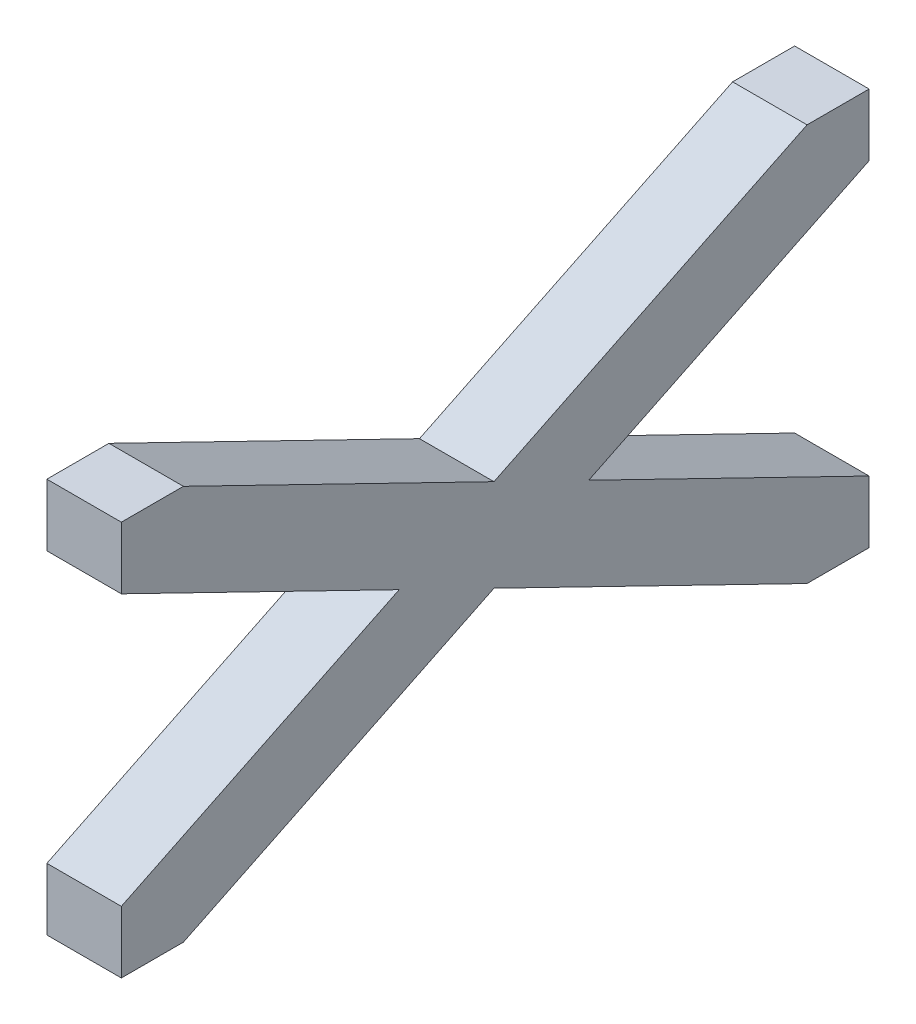
ISO-10303-21;
HEADER;
FILE_DESCRIPTION(('STEP AP214'),'2;1');
FILE_NAME('part.step','',(''),(''),'','','');
FILE_SCHEMA(('AUTOMOTIVE_DESIGN { 1 0 10303 214 1 1 1 1 }'));
ENDSEC;
DATA;
#1=APPLICATION_CONTEXT('core data for automotive mechanical design processes');
#2=APPLICATION_PROTOCOL_DEFINITION('international standard','automotive_design',2000,#1);
#3=PRODUCT_CONTEXT('',#1,'mechanical');
#4=PRODUCT('Part','Part','',(#3));
#5=PRODUCT_RELATED_PRODUCT_CATEGORY('part','',(#4));
#6=PRODUCT_DEFINITION_FORMATION('','',#4);
#7=PRODUCT_DEFINITION_CONTEXT('part definition',#1,'design');
#8=PRODUCT_DEFINITION('design','',#6,#7);
#9=PRODUCT_DEFINITION_SHAPE('','',#8);
#10=(LENGTH_UNIT() NAMED_UNIT(*) SI_UNIT(.MILLI.,.METRE.));
#11=(NAMED_UNIT(*) PLANE_ANGLE_UNIT() SI_UNIT($,.RADIAN.));
#12=(NAMED_UNIT(*) SI_UNIT($,.STERADIAN.) SOLID_ANGLE_UNIT());
#13=UNCERTAINTY_MEASURE_WITH_UNIT(LENGTH_MEASURE(1.E-05),#10,'distance_accuracy_value','');
#14=(GEOMETRIC_REPRESENTATION_CONTEXT(3) GLOBAL_UNCERTAINTY_ASSIGNED_CONTEXT((#13)) GLOBAL_UNIT_ASSIGNED_CONTEXT((#10,
#11,#12)) REPRESENTATION_CONTEXT('',''));
#15=CARTESIAN_POINT('',(0.,0.,0.));
#16=DIRECTION('',(0.,0.,1.));
#17=DIRECTION('',(1.,0.,0.));
#18=AXIS2_PLACEMENT_3D('',#15,#16,#17);
#19=CARTESIAN_POINT('',(-30.3695533772294,51.8366692938178,112.227241805575));
#20=DIRECTION('',(0.,0.,1.));
#21=DIRECTION('',(1.,0.,0.));
#22=AXIS2_PLACEMENT_3D('',#19,#20,#21);
#23=PLANE('',#22);
#24=DIRECTION('',(0.,-1.,0.));
#25=VECTOR('',#24,1.);
#26=CARTESIAN_POINT('',(-22.7495533772294,51.8366692938178,112.227241805575));
#27=LINE('',#26,#25);
#28=CARTESIAN_POINT('',(-22.7495533772294,51.8366692938178,112.227241805575));
#29=VERTEX_POINT('',#28);
#30=CARTESIAN_POINT('',(-22.7495533772294,45.4866692938178,112.227241805575));
#31=VERTEX_POINT('',#30);
#32=EDGE_CURVE('E179',#29,#31,#27,.T.);
#33=ORIENTED_EDGE('',*,*,#32,.F.);
#34=DIRECTION('',(1.,0.,0.));
#35=VECTOR('',#34,1.);
#36=CARTESIAN_POINT('',(-30.3695533772294,51.8366692938178,112.227241805575));
#37=LINE('',#36,#35);
#38=CARTESIAN_POINT('',(-30.3695533772294,51.8366692938178,112.227241805575));
#39=VERTEX_POINT('',#38);
#40=EDGE_CURVE('E11',#39,#29,#37,.T.);
#41=ORIENTED_EDGE('',*,*,#40,.F.);
#42=DIRECTION('',(0.,-1.,0.));
#43=VECTOR('',#42,1.);
#44=CARTESIAN_POINT('',(-30.3695533772294,51.8366692938178,112.227241805575));
#45=LINE('',#44,#43);
#46=CARTESIAN_POINT('',(-30.3695533772294,45.4866692938178,112.227241805575));
#47=VERTEX_POINT('',#46);
#48=EDGE_CURVE('E223',#39,#47,#45,.T.);
#49=ORIENTED_EDGE('',*,*,#48,.T.);
#50=DIRECTION('',(1.,0.,0.));
#51=VECTOR('',#50,1.);
#52=CARTESIAN_POINT('',(-30.3695533772294,45.4866692938178,112.227241805575));
#53=LINE('',#52,#51);
#54=EDGE_CURVE('E37',#47,#31,#53,.T.);
#55=ORIENTED_EDGE('',*,*,#54,.T.);
#56=EDGE_LOOP('',(#33,#41,#49,#55));
#57=FACE_BOUND('',#56,.T.);
#58=ADVANCED_FACE('F34',(#57),#23,.T.);
#59=CARTESIAN_POINT('',(-30.3695533772294,51.8366692938178,112.227241805575));
#60=DIRECTION('',(0.,1.,0.));
#61=DIRECTION('',(0.,0.,1.));
#62=AXIS2_PLACEMENT_3D('',#59,#60,#61);
#63=PLANE('',#62);
#64=DIRECTION('',(0.,0.,1.));
#65=VECTOR('',#64,1.);
#66=CARTESIAN_POINT('',(-22.7495533772294,51.8366692938178,112.227241805575));
#67=LINE('',#66,#65);
#68=CARTESIAN_POINT('',(-22.7495533772294,51.8366692938178,105.877241805575));
#69=VERTEX_POINT('',#68);
#70=EDGE_CURVE('E221',#69,#29,#67,.T.);
#71=ORIENTED_EDGE('',*,*,#70,.F.);
#72=DIRECTION('',(1.,0.,0.));
#73=VECTOR('',#72,1.);
#74=CARTESIAN_POINT('',(-30.3695533772294,51.8366692938178,105.877241805575));
#75=LINE('',#74,#73);
#76=CARTESIAN_POINT('',(-30.3695533772294,51.8366692938178,105.877241805575));
#77=VERTEX_POINT('',#76);
#78=EDGE_CURVE('E43',#77,#69,#75,.T.);
#79=ORIENTED_EDGE('',*,*,#78,.F.);
#80=DIRECTION('',(0.,0.,1.));
#81=VECTOR('',#80,1.);
#82=CARTESIAN_POINT('',(-30.3695533772294,51.8366692938178,112.227241805575));
#83=LINE('',#82,#81);
#84=EDGE_CURVE('E169',#77,#39,#83,.T.);
#85=ORIENTED_EDGE('',*,*,#84,.T.);
#86=ORIENTED_EDGE('',*,*,#40,.T.);
#87=EDGE_LOOP('',(#71,#79,#85,#86));
#88=FACE_BOUND('',#87,.T.);
#89=ADVANCED_FACE('F251',(#88),#63,.T.);
#90=CARTESIAN_POINT('',(-30.3695533772294,36.3641897169353,74.1045971681835));
#91=DIRECTION('',(0.,0.899062287593849,-0.437820743029057));
#92=DIRECTION('',(0.,0.437820743029057,0.899062287593849));
#93=AXIS2_PLACEMENT_3D('',#90,#91,#92);
#94=PLANE('',#93);
#95=DIRECTION('',(0.,0.437820743029056,0.899062287593849));
#96=VECTOR('',#95,1.);
#97=CARTESIAN_POINT('',(-22.7495533772294,36.3641897169353,74.1045971681835));
#98=LINE('',#97,#96);
#99=CARTESIAN_POINT('',(-22.7495533772294,36.3641897169353,74.1045971681835));
#100=VERTEX_POINT('',#99);
#101=EDGE_CURVE('E156',#100,#69,#98,.T.);
#102=ORIENTED_EDGE('',*,*,#101,.F.);
#103=DIRECTION('',(1.,0.,0.));
#104=VECTOR('',#103,1.);
#105=CARTESIAN_POINT('',(-30.3695533772294,36.3641897169353,74.1045971681835));
#106=LINE('',#105,#104);
#107=CARTESIAN_POINT('',(-30.3695533772294,36.3641897169353,74.1045971681835));
#108=VERTEX_POINT('',#107);
#109=EDGE_CURVE('E151',#108,#100,#106,.T.);
#110=ORIENTED_EDGE('',*,*,#109,.F.);
#111=DIRECTION('',(0.,0.437820743029056,0.899062287593849));
#112=VECTOR('',#111,1.);
#113=CARTESIAN_POINT('',(-30.3695533772294,36.3641897169353,74.1045971681835));
#114=LINE('',#113,#112);
#115=EDGE_CURVE('E154',#108,#77,#114,.T.);
#116=ORIENTED_EDGE('',*,*,#115,.T.);
#117=ORIENTED_EDGE('',*,*,#78,.T.);
#118=EDGE_LOOP('',(#102,#110,#116,#117));
#119=FACE_BOUND('',#118,.T.);
#120=ADVANCED_FACE('F153',(#119),#94,.T.);
#121=CARTESIAN_POINT('',(-30.3695533772294,36.3641897169353,74.1045971681835));
#122=DIRECTION('',(0.,0.899062287593849,0.437820743029056));
#123=DIRECTION('',(0.,-0.437820743029056,0.899062287593849));
#124=AXIS2_PLACEMENT_3D('',#121,#122,#123);
#125=PLANE('',#124);
#126=DIRECTION('',(0.,-0.437820743029056,0.899062287593849));
#127=VECTOR('',#126,1.);
#128=CARTESIAN_POINT('',(-22.7495533772294,36.3641897169353,74.1045971681835));
#129=LINE('',#128,#127);
#130=CARTESIAN_POINT('',(-22.7495533772294,51.9630444961881,42.0724418055752));
#131=VERTEX_POINT('',#130);
#132=EDGE_CURVE('E218',#131,#100,#129,.T.);
#133=ORIENTED_EDGE('',*,*,#132,.F.);
#134=DIRECTION('',(1.,0.,0.));
#135=VECTOR('',#134,1.);
#136=CARTESIAN_POINT('',(-30.3695533772294,51.9630444961881,42.0724418055752));
#137=LINE('',#136,#135);
#138=CARTESIAN_POINT('',(-30.3695533772294,51.9630444961881,42.0724418055752));
#139=VERTEX_POINT('',#138);
#140=EDGE_CURVE('E161',#139,#131,#137,.T.);
#141=ORIENTED_EDGE('',*,*,#140,.F.);
#142=DIRECTION('',(0.,-0.437820743029056,0.899062287593849));
#143=VECTOR('',#142,1.);
#144=CARTESIAN_POINT('',(-30.3695533772294,36.3641897169353,74.1045971681835));
#145=LINE('',#144,#143);
#146=EDGE_CURVE('E167',#139,#108,#145,.T.);
#147=ORIENTED_EDGE('',*,*,#146,.T.);
#148=ORIENTED_EDGE('',*,*,#109,.T.);
#149=EDGE_LOOP('',(#133,#141,#147,#148));
#150=FACE_BOUND('',#149,.T.);
#151=ADVANCED_FACE('F171',(#150),#125,.T.);
#152=CARTESIAN_POINT('',(-30.3695533772294,51.9630444961881,35.7224418055752));
#153=DIRECTION('',(0.,1.,0.));
#154=DIRECTION('',(0.,0.,1.));
#155=AXIS2_PLACEMENT_3D('',#152,#153,#154);
#156=PLANE('',#155);
#157=DIRECTION('',(0.,0.,1.));
#158=VECTOR('',#157,1.);
#159=CARTESIAN_POINT('',(-22.7495533772294,51.9630444961881,35.7224418055752));
#160=LINE('',#159,#158);
#161=CARTESIAN_POINT('',(-22.7495533772294,51.9630444961881,35.7224418055752));
#162=VERTEX_POINT('',#161);
#163=EDGE_CURVE('E215',#162,#131,#160,.T.);
#164=ORIENTED_EDGE('',*,*,#163,.F.);
#165=DIRECTION('',(1.,0.,0.));
#166=VECTOR('',#165,1.);
#167=CARTESIAN_POINT('',(-30.3695533772294,51.9630444961881,35.7224418055752));
#168=LINE('',#167,#166);
#169=CARTESIAN_POINT('',(-30.3695533772294,51.9630444961881,35.7224418055752));
#170=VERTEX_POINT('',#169);
#171=EDGE_CURVE('E227',#170,#162,#168,.T.);
#172=ORIENTED_EDGE('',*,*,#171,.F.);
#173=DIRECTION('',(0.,0.,1.));
#174=VECTOR('',#173,1.);
#175=CARTESIAN_POINT('',(-30.3695533772294,51.9630444961881,35.7224418055752));
#176=LINE('',#175,#174);
#177=EDGE_CURVE('E172',#170,#139,#176,.T.);
#178=ORIENTED_EDGE('',*,*,#177,.T.);
#179=ORIENTED_EDGE('',*,*,#140,.T.);
#180=EDGE_LOOP('',(#164,#172,#178,#179));
#181=FACE_BOUND('',#180,.T.);
#182=ADVANCED_FACE('F264',(#181),#156,.T.);
#183=CARTESIAN_POINT('',(-30.3695533772294,51.9630444961881,35.7224418055752));
#184=DIRECTION('',(0.,0.,-1.));
#185=DIRECTION('',(0.,1.,0.));
#186=AXIS2_PLACEMENT_3D('',#183,#184,#185);
#187=PLANE('',#186);
#188=DIRECTION('',(0.,1.,0.));
#189=VECTOR('',#188,1.);
#190=CARTESIAN_POINT('',(-22.7495533772294,51.9630444961881,35.7224418055752));
#191=LINE('',#190,#189);
#192=CARTESIAN_POINT('',(-22.7495533772294,45.6130444961881,35.7224418055753));
#193=VERTEX_POINT('',#192);
#194=EDGE_CURVE('E212',#193,#162,#191,.T.);
#195=ORIENTED_EDGE('',*,*,#194,.F.);
#196=DIRECTION('',(1.,0.,0.));
#197=VECTOR('',#196,1.);
#198=CARTESIAN_POINT('',(-30.3695533772294,45.6130444961881,35.7224418055753));
#199=LINE('',#198,#197);
#200=CARTESIAN_POINT('',(-30.3695533772294,45.6130444961881,35.7224418055753));
#201=VERTEX_POINT('',#200);
#202=EDGE_CURVE('E229',#201,#193,#199,.T.);
#203=ORIENTED_EDGE('',*,*,#202,.F.);
#204=DIRECTION('',(0.,1.,0.));
#205=VECTOR('',#204,1.);
#206=CARTESIAN_POINT('',(-30.3695533772294,51.9630444961881,35.7224418055752));
#207=LINE('',#206,#205);
#208=EDGE_CURVE('E174',#201,#170,#207,.T.);
#209=ORIENTED_EDGE('',*,*,#208,.T.);
#210=ORIENTED_EDGE('',*,*,#171,.T.);
#211=EDGE_LOOP('',(#195,#203,#209,#210));
#212=FACE_BOUND('',#211,.T.);
#213=ADVANCED_FACE('F267',(#212),#187,.T.);
#214=CARTESIAN_POINT('',(-30.3695533772294,45.6130444961881,35.7224418055753));
#215=DIRECTION('',(0.,-0.899062287593849,-0.437820743029056));
#216=DIRECTION('',(0.,0.437820743029056,-0.899062287593849));
#217=AXIS2_PLACEMENT_3D('',#214,#215,#216);
#218=PLANE('',#217);
#219=DIRECTION('',(0.,0.437820743029056,-0.899062287593849));
#220=VECTOR('',#219,1.);
#221=CARTESIAN_POINT('',(-22.7495533772294,45.6130444961881,35.7224418055753));
#222=LINE('',#221,#220);
#223=CARTESIAN_POINT('',(-22.7495533772294,31.6430444961881,64.4097535825153));
#224=VERTEX_POINT('',#223);
#225=EDGE_CURVE('E209',#224,#193,#222,.T.);
#226=ORIENTED_EDGE('',*,*,#225,.F.);
#227=DIRECTION('',(1.,0.,0.));
#228=VECTOR('',#227,1.);
#229=CARTESIAN_POINT('',(-30.3695533772294,31.6430444961881,64.4097535825153));
#230=LINE('',#229,#228);
#231=CARTESIAN_POINT('',(-30.3695533772294,31.6430444961881,64.4097535825153));
#232=VERTEX_POINT('',#231);
#233=EDGE_CURVE('E231',#232,#224,#230,.T.);
#234=ORIENTED_EDGE('',*,*,#233,.F.);
#235=DIRECTION('',(0.,0.437820743029056,-0.899062287593849));
#236=VECTOR('',#235,1.);
#237=CARTESIAN_POINT('',(-30.3695533772294,45.6130444961881,35.7224418055753));
#238=LINE('',#237,#236);
#239=EDGE_CURVE('E448',#232,#201,#238,.T.);
#240=ORIENTED_EDGE('',*,*,#239,.T.);
#241=ORIENTED_EDGE('',*,*,#202,.T.);
#242=EDGE_LOOP('',(#226,#234,#240,#241));
#243=FACE_BOUND('',#242,.T.);
#244=ADVANCED_FACE('F271',(#243),#218,.T.);
#245=CARTESIAN_POINT('',(-30.3695533772294,17.6730444961882,35.7224418055753));
#246=DIRECTION('',(0.,0.899062287593849,-0.437820743029056));
#247=DIRECTION('',(0.,0.437820743029056,0.899062287593849));
#248=AXIS2_PLACEMENT_3D('',#245,#246,#247);
#249=PLANE('',#248);
#250=DIRECTION('',(0.,0.437820743029056,0.899062287593849));
#251=VECTOR('',#250,1.);
#252=CARTESIAN_POINT('',(-22.7495533772294,17.6730444961882,35.7224418055753));
#253=LINE('',#252,#251);
#254=CARTESIAN_POINT('',(-22.7495533772294,17.6730444961882,35.7224418055753));
#255=VERTEX_POINT('',#254);
#256=EDGE_CURVE('E206',#255,#224,#253,.T.);
#257=ORIENTED_EDGE('',*,*,#256,.F.);
#258=DIRECTION('',(1.,0.,0.));
#259=VECTOR('',#258,1.);
#260=CARTESIAN_POINT('',(-30.3695533772294,17.6730444961882,35.7224418055753));
#261=LINE('',#260,#259);
#262=CARTESIAN_POINT('',(-30.3695533772294,17.6730444961882,35.7224418055753));
#263=VERTEX_POINT('',#262);
#264=EDGE_CURVE('E233',#263,#255,#261,.T.);
#265=ORIENTED_EDGE('',*,*,#264,.F.);
#266=DIRECTION('',(0.,0.437820743029056,0.899062287593849));
#267=VECTOR('',#266,1.);
#268=CARTESIAN_POINT('',(-30.3695533772294,17.6730444961882,35.7224418055753));
#269=LINE('',#268,#267);
#270=EDGE_CURVE('E444',#263,#232,#269,.T.);
#271=ORIENTED_EDGE('',*,*,#270,.T.);
#272=ORIENTED_EDGE('',*,*,#233,.T.);
#273=EDGE_LOOP('',(#257,#265,#271,#272));
#274=FACE_BOUND('',#273,.T.);
#275=ADVANCED_FACE('F275',(#274),#249,.T.);
#276=CARTESIAN_POINT('',(-30.3695533772294,11.3230444961881,35.7224418055752));
#277=DIRECTION('',(0.,0.,-1.));
#278=DIRECTION('',(0.,1.,0.));
#279=AXIS2_PLACEMENT_3D('',#276,#277,#278);
#280=PLANE('',#279);
#281=DIRECTION('',(0.,1.,0.));
#282=VECTOR('',#281,1.);
#283=CARTESIAN_POINT('',(-22.7495533772294,11.3230444961881,35.7224418055752));
#284=LINE('',#283,#282);
#285=CARTESIAN_POINT('',(-22.7495533772294,11.3230444961881,35.7224418055752));
#286=VERTEX_POINT('',#285);
#287=EDGE_CURVE('E203',#286,#255,#284,.T.);
#288=ORIENTED_EDGE('',*,*,#287,.F.);
#289=DIRECTION('',(1.,0.,0.));
#290=VECTOR('',#289,1.);
#291=CARTESIAN_POINT('',(-30.3695533772294,11.3230444961881,35.7224418055752));
#292=LINE('',#291,#290);
#293=CARTESIAN_POINT('',(-30.3695533772294,11.3230444961881,35.7224418055752));
#294=VERTEX_POINT('',#293);
#295=EDGE_CURVE('E235',#294,#286,#292,.T.);
#296=ORIENTED_EDGE('',*,*,#295,.F.);
#297=DIRECTION('',(0.,1.,0.));
#298=VECTOR('',#297,1.);
#299=CARTESIAN_POINT('',(-30.3695533772294,11.3230444961881,35.7224418055752));
#300=LINE('',#299,#298);
#301=EDGE_CURVE('E455',#294,#263,#300,.T.);
#302=ORIENTED_EDGE('',*,*,#301,.T.);
#303=ORIENTED_EDGE('',*,*,#264,.T.);
#304=EDGE_LOOP('',(#288,#296,#302,#303));
#305=FACE_BOUND('',#304,.T.);
#306=ADVANCED_FACE('F279',(#305),#280,.T.);
#307=CARTESIAN_POINT('',(-30.3695533772294,11.3230444961881,35.7224418055752));
#308=DIRECTION('',(0.,-1.,0.));
#309=DIRECTION('',(0.,0.,-1.));
#310=AXIS2_PLACEMENT_3D('',#307,#308,#309);
#311=PLANE('',#310);
#312=DIRECTION('',(0.,0.,-1.));
#313=VECTOR('',#312,1.);
#314=CARTESIAN_POINT('',(-22.7495533772294,11.3230444961881,35.7224418055752));
#315=LINE('',#314,#313);
#316=CARTESIAN_POINT('',(-22.7495533772294,11.3230444961881,42.0724418055752));
#317=VERTEX_POINT('',#316);
#318=EDGE_CURVE('E200',#317,#286,#315,.T.);
#319=ORIENTED_EDGE('',*,*,#318,.F.);
#320=DIRECTION('',(1.,0.,0.));
#321=VECTOR('',#320,1.);
#322=CARTESIAN_POINT('',(-30.3695533772294,11.3230444961881,42.0724418055752));
#323=LINE('',#322,#321);
#324=CARTESIAN_POINT('',(-30.3695533772294,11.3230444961881,42.0724418055752));
#325=VERTEX_POINT('',#324);
#326=EDGE_CURVE('E237',#325,#317,#323,.T.);
#327=ORIENTED_EDGE('',*,*,#326,.F.);
#328=DIRECTION('',(0.,0.,-1.));
#329=VECTOR('',#328,1.);
#330=CARTESIAN_POINT('',(-30.3695533772294,11.3230444961881,35.7224418055752));
#331=LINE('',#330,#329);
#332=EDGE_CURVE('E437',#325,#294,#331,.T.);
#333=ORIENTED_EDGE('',*,*,#332,.T.);
#334=ORIENTED_EDGE('',*,*,#295,.T.);
#335=EDGE_LOOP('',(#319,#327,#333,#334));
#336=FACE_BOUND('',#335,.T.);
#337=ADVANCED_FACE('F283',(#336),#311,.T.);
#338=CARTESIAN_POINT('',(-30.3695533772294,26.921899275441,74.1045971681834));
#339=DIRECTION('',(0.,-0.899062287593849,0.437820743029056));
#340=DIRECTION('',(0.,-0.437820743029056,-0.899062287593849));
#341=AXIS2_PLACEMENT_3D('',#338,#339,#340);
#342=PLANE('',#341);
#343=DIRECTION('',(0.,-0.437820743029056,-0.899062287593849));
#344=VECTOR('',#343,1.);
#345=CARTESIAN_POINT('',(-22.7495533772294,26.921899275441,74.1045971681834));
#346=LINE('',#345,#344);
#347=CARTESIAN_POINT('',(-22.7495533772294,26.921899275441,74.1045971681834));
#348=VERTEX_POINT('',#347);
#349=EDGE_CURVE('E197',#348,#317,#346,.T.);
#350=ORIENTED_EDGE('',*,*,#349,.F.);
#351=DIRECTION('',(1.,0.,0.));
#352=VECTOR('',#351,1.);
#353=CARTESIAN_POINT('',(-30.3695533772294,26.921899275441,74.1045971681834));
#354=LINE('',#353,#352);
#355=CARTESIAN_POINT('',(-30.3695533772294,26.921899275441,74.1045971681834));
#356=VERTEX_POINT('',#355);
#357=EDGE_CURVE('E239',#356,#348,#354,.T.);
#358=ORIENTED_EDGE('',*,*,#357,.F.);
#359=DIRECTION('',(0.,-0.437820743029056,-0.899062287593849));
#360=VECTOR('',#359,1.);
#361=CARTESIAN_POINT('',(-30.3695533772294,26.921899275441,74.1045971681834));
#362=LINE('',#361,#360);
#363=EDGE_CURVE('E433',#356,#325,#362,.T.);
#364=ORIENTED_EDGE('',*,*,#363,.T.);
#365=ORIENTED_EDGE('',*,*,#326,.T.);
#366=EDGE_LOOP('',(#350,#358,#364,#365));
#367=FACE_BOUND('',#366,.T.);
#368=ADVANCED_FACE('F287',(#367),#342,.T.);
#369=CARTESIAN_POINT('',(-30.3695533772294,26.921899275441,74.1045971681834));
#370=DIRECTION('',(0.,-0.899062287593849,-0.437820743029056));
#371=DIRECTION('',(0.,0.437820743029056,-0.899062287593849));
#372=AXIS2_PLACEMENT_3D('',#369,#370,#371);
#373=PLANE('',#372);
#374=DIRECTION('',(0.,0.437820743029056,-0.899062287593849));
#375=VECTOR('',#374,1.);
#376=CARTESIAN_POINT('',(-22.7495533772294,26.921899275441,74.1045971681834));
#377=LINE('',#376,#375);
#378=CARTESIAN_POINT('',(-22.7495533772294,11.4494196985585,105.877241805575));
#379=VERTEX_POINT('',#378);
#380=EDGE_CURVE('E194',#379,#348,#377,.T.);
#381=ORIENTED_EDGE('',*,*,#380,.F.);
#382=DIRECTION('',(1.,0.,0.));
#383=VECTOR('',#382,1.);
#384=CARTESIAN_POINT('',(-30.3695533772294,11.4494196985585,105.877241805575));
#385=LINE('',#384,#383);
#386=CARTESIAN_POINT('',(-30.3695533772294,11.4494196985585,105.877241805575));
#387=VERTEX_POINT('',#386);
#388=EDGE_CURVE('E241',#387,#379,#385,.T.);
#389=ORIENTED_EDGE('',*,*,#388,.F.);
#390=DIRECTION('',(0.,0.437820743029056,-0.899062287593849));
#391=VECTOR('',#390,1.);
#392=CARTESIAN_POINT('',(-30.3695533772294,26.921899275441,74.1045971681834));
#393=LINE('',#392,#391);
#394=EDGE_CURVE('E459',#387,#356,#393,.T.);
#395=ORIENTED_EDGE('',*,*,#394,.T.);
#396=ORIENTED_EDGE('',*,*,#357,.T.);
#397=EDGE_LOOP('',(#381,#389,#395,#396));
#398=FACE_BOUND('',#397,.T.);
#399=ADVANCED_FACE('F291',(#398),#373,.T.);
#400=CARTESIAN_POINT('',(-30.3695533772294,11.4494196985585,112.227241805575));
#401=DIRECTION('',(0.,-1.,0.));
#402=DIRECTION('',(0.,0.,-1.));
#403=AXIS2_PLACEMENT_3D('',#400,#401,#402);
#404=PLANE('',#403);
#405=DIRECTION('',(0.,0.,-1.));
#406=VECTOR('',#405,1.);
#407=CARTESIAN_POINT('',(-22.7495533772294,11.4494196985585,112.227241805575));
#408=LINE('',#407,#406);
#409=CARTESIAN_POINT('',(-22.7495533772294,11.4494196985585,112.227241805575));
#410=VERTEX_POINT('',#409);
#411=EDGE_CURVE('E191',#410,#379,#408,.T.);
#412=ORIENTED_EDGE('',*,*,#411,.F.);
#413=DIRECTION('',(1.,0.,0.));
#414=VECTOR('',#413,1.);
#415=CARTESIAN_POINT('',(-30.3695533772294,11.4494196985585,112.227241805575));
#416=LINE('',#415,#414);
#417=CARTESIAN_POINT('',(-30.3695533772294,11.4494196985585,112.227241805575));
#418=VERTEX_POINT('',#417);
#419=EDGE_CURVE('E243',#418,#410,#416,.T.);
#420=ORIENTED_EDGE('',*,*,#419,.F.);
#421=DIRECTION('',(0.,0.,-1.));
#422=VECTOR('',#421,1.);
#423=CARTESIAN_POINT('',(-30.3695533772294,11.4494196985585,112.227241805575));
#424=LINE('',#423,#422);
#425=EDGE_CURVE('E426',#418,#387,#424,.T.);
#426=ORIENTED_EDGE('',*,*,#425,.T.);
#427=ORIENTED_EDGE('',*,*,#388,.T.);
#428=EDGE_LOOP('',(#412,#420,#426,#427));
#429=FACE_BOUND('',#428,.T.);
#430=ADVANCED_FACE('F295',(#429),#404,.T.);
#431=CARTESIAN_POINT('',(-30.3695533772294,11.4494196985585,112.227241805575));
#432=DIRECTION('',(0.,0.,1.));
#433=DIRECTION('',(1.,0.,0.));
#434=AXIS2_PLACEMENT_3D('',#431,#432,#433);
#435=PLANE('',#434);
#436=DIRECTION('',(0.,-1.,0.));
#437=VECTOR('',#436,1.);
#438=CARTESIAN_POINT('',(-22.7495533772294,11.4494196985585,112.227241805575));
#439=LINE('',#438,#437);
#440=CARTESIAN_POINT('',(-22.7495533772294,17.7994196985585,112.227241805575));
#441=VERTEX_POINT('',#440);
#442=EDGE_CURVE('E188',#441,#410,#439,.T.);
#443=ORIENTED_EDGE('',*,*,#442,.F.);
#444=DIRECTION('',(1.,0.,0.));
#445=VECTOR('',#444,1.);
#446=CARTESIAN_POINT('',(-30.3695533772294,17.7994196985585,112.227241805575));
#447=LINE('',#446,#445);
#448=CARTESIAN_POINT('',(-30.3695533772294,17.7994196985585,112.227241805575));
#449=VERTEX_POINT('',#448);
#450=EDGE_CURVE('E245',#449,#441,#447,.T.);
#451=ORIENTED_EDGE('',*,*,#450,.F.);
#452=DIRECTION('',(0.,-1.,0.));
#453=VECTOR('',#452,1.);
#454=CARTESIAN_POINT('',(-30.3695533772294,11.4494196985585,112.227241805575));
#455=LINE('',#454,#453);
#456=EDGE_CURVE('E422',#449,#418,#455,.T.);
#457=ORIENTED_EDGE('',*,*,#456,.T.);
#458=ORIENTED_EDGE('',*,*,#419,.T.);
#459=EDGE_LOOP('',(#443,#451,#457,#458));
#460=FACE_BOUND('',#459,.T.);
#461=ADVANCED_FACE('F299',(#460),#435,.T.);
#462=CARTESIAN_POINT('',(-30.3695533772294,17.7994196985585,112.227241805575));
#463=DIRECTION('',(0.,0.899062287593848,0.437820743029058));
#464=DIRECTION('',(0.,-0.437820743029058,0.899062287593848));
#465=AXIS2_PLACEMENT_3D('',#462,#463,#464);
#466=PLANE('',#465);
#467=DIRECTION('',(0.,-0.437820743029058,0.899062287593848));
#468=VECTOR('',#467,1.);
#469=CARTESIAN_POINT('',(-22.7495533772294,17.7994196985585,112.227241805575));
#470=LINE('',#469,#468);
#471=CARTESIAN_POINT('',(-22.7495533772294,31.6430444961882,83.7994407538517));
#472=VERTEX_POINT('',#471);
#473=EDGE_CURVE('E185',#472,#441,#470,.T.);
#474=ORIENTED_EDGE('',*,*,#473,.F.);
#475=DIRECTION('',(1.,0.,0.));
#476=VECTOR('',#475,1.);
#477=CARTESIAN_POINT('',(-30.3695533772294,31.6430444961882,83.7994407538517));
#478=LINE('',#477,#476);
#479=CARTESIAN_POINT('',(-30.3695533772294,31.6430444961882,83.7994407538517));
#480=VERTEX_POINT('',#479);
#481=EDGE_CURVE('E246',#480,#472,#478,.T.);
#482=ORIENTED_EDGE('',*,*,#481,.F.);
#483=DIRECTION('',(0.,-0.437820743029058,0.899062287593848));
#484=VECTOR('',#483,1.);
#485=CARTESIAN_POINT('',(-30.3695533772294,17.7994196985585,112.227241805575));
#486=LINE('',#485,#484);
#487=EDGE_CURVE('E463',#480,#449,#486,.T.);
#488=ORIENTED_EDGE('',*,*,#487,.T.);
#489=ORIENTED_EDGE('',*,*,#450,.T.);
#490=EDGE_LOOP('',(#474,#482,#488,#489));
#491=FACE_BOUND('',#490,.T.);
#492=ADVANCED_FACE('F303',(#491),#466,.T.);
#493=CARTESIAN_POINT('',(-30.3695533772294,45.4866692938178,112.227241805575));
#494=DIRECTION('',(0.,-0.899062287593849,0.437820743029057));
#495=DIRECTION('',(0.,-0.437820743029057,-0.899062287593849));
#496=AXIS2_PLACEMENT_3D('',#493,#494,#495);
#497=PLANE('',#496);
#498=DIRECTION('',(0.,-0.437820743029057,-0.899062287593849));
#499=VECTOR('',#498,1.);
#500=CARTESIAN_POINT('',(-22.7495533772294,45.4866692938178,112.227241805575));
#501=LINE('',#500,#499);
#502=EDGE_CURVE('E182',#31,#472,#501,.T.);
#503=ORIENTED_EDGE('',*,*,#502,.F.);
#504=ORIENTED_EDGE('',*,*,#54,.F.);
#505=DIRECTION('',(0.,-0.437820743029057,-0.899062287593849));
#506=VECTOR('',#505,1.);
#507=CARTESIAN_POINT('',(-30.3695533772294,45.4866692938178,112.227241805575));
#508=LINE('',#507,#506);
#509=EDGE_CURVE('E465',#47,#480,#508,.T.);
#510=ORIENTED_EDGE('',*,*,#509,.T.);
#511=ORIENTED_EDGE('',*,*,#481,.T.);
#512=EDGE_LOOP('',(#503,#504,#510,#511));
#513=FACE_BOUND('',#512,.T.);
#514=ADVANCED_FACE('F248',(#513),#497,.T.);
#515=CARTESIAN_POINT('',(-30.3695533772294,0.,0.));
#516=DIRECTION('',(1.,0.,0.));
#517=DIRECTION('',(0.,0.,-1.));
#518=AXIS2_PLACEMENT_3D('',#515,#516,#517);
#519=PLANE('',#518);
#520=ORIENTED_EDGE('',*,*,#48,.F.);
#521=ORIENTED_EDGE('',*,*,#84,.F.);
#522=ORIENTED_EDGE('',*,*,#115,.F.);
#523=ORIENTED_EDGE('',*,*,#146,.F.);
#524=ORIENTED_EDGE('',*,*,#177,.F.);
#525=ORIENTED_EDGE('',*,*,#208,.F.);
#526=ORIENTED_EDGE('',*,*,#239,.F.);
#527=ORIENTED_EDGE('',*,*,#270,.F.);
#528=ORIENTED_EDGE('',*,*,#301,.F.);
#529=ORIENTED_EDGE('',*,*,#332,.F.);
#530=ORIENTED_EDGE('',*,*,#363,.F.);
#531=ORIENTED_EDGE('',*,*,#394,.F.);
#532=ORIENTED_EDGE('',*,*,#425,.F.);
#533=ORIENTED_EDGE('',*,*,#456,.F.);
#534=ORIENTED_EDGE('',*,*,#487,.F.);
#535=ORIENTED_EDGE('',*,*,#509,.F.);
#536=EDGE_LOOP('',(#520,#521,#522,#523,#524,#525,#526,#527,#528,#529,#530,#531,#532,#533,#534,#535));
#537=FACE_BOUND('',#536,.T.);
#538=ADVANCED_FACE('F165',(#537),#519,.F.);
#539=CARTESIAN_POINT('',(-22.7495533772294,0.,0.));
#540=DIRECTION('',(1.,0.,0.));
#541=DIRECTION('',(0.,0.,-1.));
#542=AXIS2_PLACEMENT_3D('',#539,#540,#541);
#543=PLANE('',#542);
#544=ORIENTED_EDGE('',*,*,#32,.T.);
#545=ORIENTED_EDGE('',*,*,#502,.T.);
#546=ORIENTED_EDGE('',*,*,#473,.T.);
#547=ORIENTED_EDGE('',*,*,#442,.T.);
#548=ORIENTED_EDGE('',*,*,#411,.T.);
#549=ORIENTED_EDGE('',*,*,#380,.T.);
#550=ORIENTED_EDGE('',*,*,#349,.T.);
#551=ORIENTED_EDGE('',*,*,#318,.T.);
#552=ORIENTED_EDGE('',*,*,#287,.T.);
#553=ORIENTED_EDGE('',*,*,#256,.T.);
#554=ORIENTED_EDGE('',*,*,#225,.T.);
#555=ORIENTED_EDGE('',*,*,#194,.T.);
#556=ORIENTED_EDGE('',*,*,#163,.T.);
#557=ORIENTED_EDGE('',*,*,#132,.T.);
#558=ORIENTED_EDGE('',*,*,#101,.T.);
#559=ORIENTED_EDGE('',*,*,#70,.T.);
#560=EDGE_LOOP('',(#544,#545,#546,#547,#548,#549,#550,#551,#552,#553,#554,#555,#556,#557,#558,#559));
#561=FACE_BOUND('',#560,.T.);
#562=ADVANCED_FACE('F250',(#561),#543,.T.);
#563=CLOSED_SHELL('',(#58,#89,#120,#151,#182,#213,#244,#275,#306,#337,#368,#399,#430,#461,#492,
#514,#538,#562));
#564=MANIFOLD_SOLID_BREP('B2',#563);
#565=ADVANCED_BREP_SHAPE_REPRESENTATION('',(#18,#564),#14);
#566=SHAPE_DEFINITION_REPRESENTATION(#9,#565);
ENDSEC;
END-ISO-10303-21;
